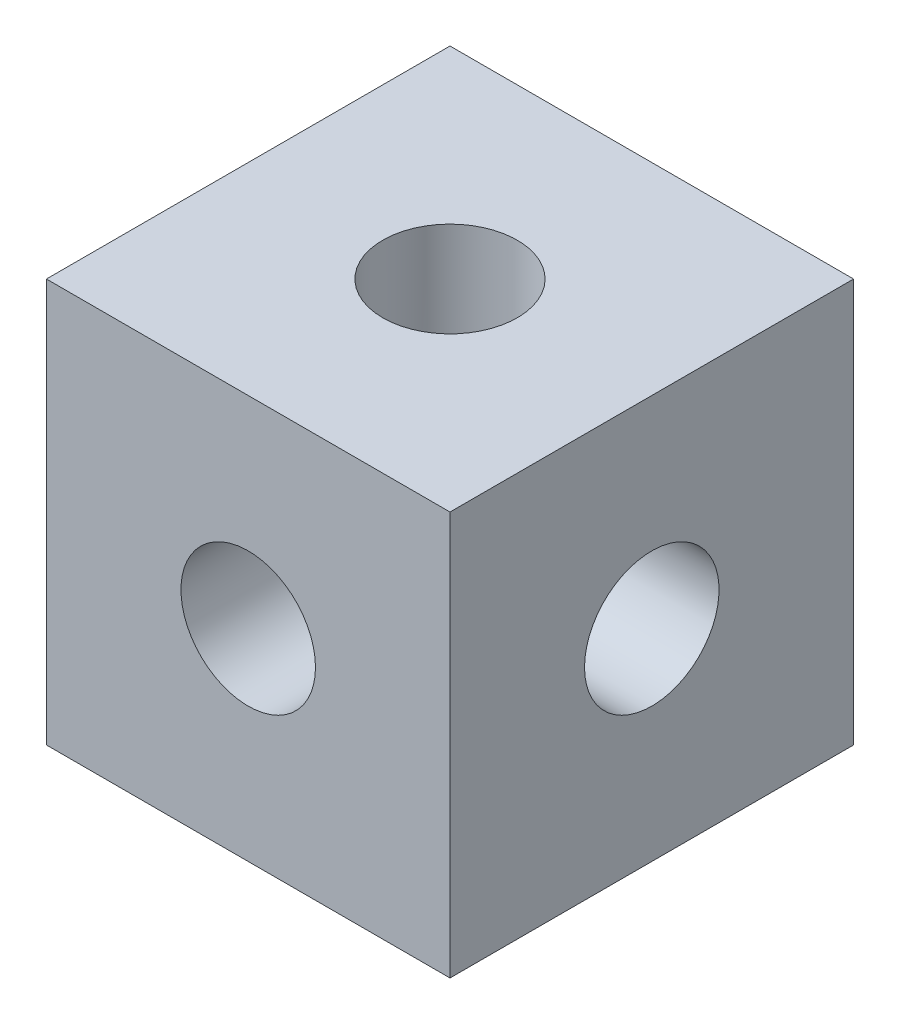
ISO-10303-21;
HEADER;
FILE_DESCRIPTION(('STEP AP214'),'2;1');
FILE_NAME('part.step','',(''),(''),'','','');
FILE_SCHEMA(('AUTOMOTIVE_DESIGN { 1 0 10303 214 1 1 1 1 }'));
ENDSEC;
DATA;
#1=APPLICATION_CONTEXT('core data for automotive mechanical design processes');
#2=APPLICATION_PROTOCOL_DEFINITION('international standard','automotive_design',2000,#1);
#3=PRODUCT_CONTEXT('',#1,'mechanical');
#4=PRODUCT('Part','Part','',(#3));
#5=PRODUCT_RELATED_PRODUCT_CATEGORY('part','',(#4));
#6=PRODUCT_DEFINITION_FORMATION('','',#4);
#7=PRODUCT_DEFINITION_CONTEXT('part definition',#1,'design');
#8=PRODUCT_DEFINITION('design','',#6,#7);
#9=PRODUCT_DEFINITION_SHAPE('','',#8);
#10=(LENGTH_UNIT() NAMED_UNIT(*) SI_UNIT(.MILLI.,.METRE.));
#11=(NAMED_UNIT(*) PLANE_ANGLE_UNIT() SI_UNIT($,.RADIAN.));
#12=(NAMED_UNIT(*) SI_UNIT($,.STERADIAN.) SOLID_ANGLE_UNIT());
#13=UNCERTAINTY_MEASURE_WITH_UNIT(LENGTH_MEASURE(1.E-05),#10,'distance_accuracy_value','');
#14=(GEOMETRIC_REPRESENTATION_CONTEXT(3) GLOBAL_UNCERTAINTY_ASSIGNED_CONTEXT((#13)) GLOBAL_UNIT_ASSIGNED_CONTEXT((#10,
#11,#12)) REPRESENTATION_CONTEXT('',''));
#15=CARTESIAN_POINT('',(0.,0.,0.));
#16=DIRECTION('',(0.,0.,1.));
#17=DIRECTION('',(1.,0.,0.));
#18=AXIS2_PLACEMENT_3D('',#15,#16,#17);
#19=CARTESIAN_POINT('',(0.,0.,0.));
#20=DIRECTION('',(0.,1.,0.));
#21=DIRECTION('',(0.,0.,1.));
#22=AXIS2_PLACEMENT_3D('',#19,#20,#21);
#23=CYLINDRICAL_SURFACE('',#22,2.5);
#24=CARTESIAN_POINT('',(0.,15.,0.));
#25=DIRECTION('',(0.,1.,0.));
#26=DIRECTION('',(0.,0.,1.));
#27=AXIS2_PLACEMENT_3D('',#24,#25,#26);
#28=CIRCLE('',#27,2.5);
#29=CARTESIAN_POINT('',(0.,15.,2.5));
#30=VERTEX_POINT('',#29);
#31=EDGE_CURVE('E175',#30,#30,#28,.T.);
#32=ORIENTED_EDGE('',*,*,#31,.T.);
#33=EDGE_LOOP('',(#32));
#34=FACE_BOUND('',#33,.T.);
#35=CARTESIAN_POINT('',(0.,7.50000000000001,0.));
#36=DIRECTION('',(0.707106781186547,0.707106781186547,0.));
#37=DIRECTION('',(-0.707106781186547,0.707106781186547,0.));
#38=AXIS2_PLACEMENT_3D('',#35,#36,#37);
#39=ELLIPSE('',#38,3.53553390593274,2.5);
#40=CARTESIAN_POINT('',(-1.76776695296638,9.26776695296639,1.76776695296637));
#41=VERTEX_POINT('',#40);
#42=CARTESIAN_POINT('',(-1.76776695296638,9.26776695296638,-1.76776695296636));
#43=VERTEX_POINT('',#42);
#44=EDGE_CURVE('E115',#41,#43,#39,.F.);
#45=ORIENTED_EDGE('',*,*,#44,.T.);
#46=CARTESIAN_POINT('',(0.,7.50000000000002,0.));
#47=DIRECTION('',(0.,0.707106781186547,0.707106781186547));
#48=DIRECTION('',(0.,0.707106781186547,-0.707106781186547));
#49=AXIS2_PLACEMENT_3D('',#46,#47,#48);
#50=ELLIPSE('',#49,3.53553390593274,2.5);
#51=CARTESIAN_POINT('',(1.76776695296636,9.26776695296637,-1.76776695296637));
#52=VERTEX_POINT('',#51);
#53=EDGE_CURVE('E103',#43,#52,#50,.F.);
#54=ORIENTED_EDGE('',*,*,#53,.T.);
#55=CARTESIAN_POINT('',(0.,7.50000000000001,0.));
#56=DIRECTION('',(-0.707106781186547,0.707106781186547,0.));
#57=DIRECTION('',(0.707106781186547,0.707106781186547,0.));
#58=AXIS2_PLACEMENT_3D('',#55,#56,#57);
#59=ELLIPSE('',#58,3.53553390593274,2.5);
#60=CARTESIAN_POINT('',(1.76776695296636,9.26776695296637,1.76776695296639));
#61=VERTEX_POINT('',#60);
#62=EDGE_CURVE('E110',#52,#61,#59,.F.);
#63=ORIENTED_EDGE('',*,*,#62,.T.);
#64=CARTESIAN_POINT('',(0.,7.50000000000002,0.));
#65=DIRECTION('',(0.,0.707106781186547,-0.707106781186547));
#66=DIRECTION('',(0.,0.707106781186547,0.707106781186547));
#67=AXIS2_PLACEMENT_3D('',#64,#65,#66);
#68=ELLIPSE('',#67,3.53553390593274,2.5);
#69=EDGE_CURVE('E55',#61,#41,#68,.F.);
#70=ORIENTED_EDGE('',*,*,#69,.T.);
#71=EDGE_LOOP('',(#45,#54,#63,#70));
#72=FACE_BOUND('',#71,.T.);
#73=ADVANCED_FACE('F39',(#34,#72),#23,.F.);
#74=CARTESIAN_POINT('',(7.49999999999998,15.,7.50000000000002));
#75=DIRECTION('',(-1.,0.,0.));
#76=DIRECTION('',(0.,0.,1.));
#77=AXIS2_PLACEMENT_3D('',#74,#75,#76);
#78=PLANE('',#77);
#79=CARTESIAN_POINT('',(7.49999999999998,7.50000000000001,0.));
#80=DIRECTION('',(-1.,0.,0.));
#81=DIRECTION('',(0.,0.,1.));
#82=AXIS2_PLACEMENT_3D('',#79,#80,#81);
#83=CIRCLE('',#82,2.5);
#84=CARTESIAN_POINT('',(7.49999999999998,7.50000000000001,2.50000000000002));
#85=VERTEX_POINT('',#84);
#86=EDGE_CURVE('E179',#85,#85,#83,.T.);
#87=ORIENTED_EDGE('',*,*,#86,.T.);
#88=EDGE_LOOP('',(#87));
#89=FACE_BOUND('',#88,.T.);
#90=DIRECTION('',(0.,0.,-1.));
#91=VECTOR('',#90,1.);
#92=CARTESIAN_POINT('',(7.49999999999998,0.,7.50000000000002));
#93=LINE('',#92,#91);
#94=CARTESIAN_POINT('',(7.49999999999998,0.,7.50000000000002));
#95=VERTEX_POINT('',#94);
#96=CARTESIAN_POINT('',(7.49999999999998,0.,-7.49999999999999));
#97=VERTEX_POINT('',#96);
#98=EDGE_CURVE('E159',#95,#97,#93,.T.);
#99=ORIENTED_EDGE('',*,*,#98,.T.);
#100=DIRECTION('',(0.,-1.,0.));
#101=VECTOR('',#100,1.);
#102=CARTESIAN_POINT('',(7.49999999999998,15.,-7.49999999999999));
#103=LINE('',#102,#101);
#104=CARTESIAN_POINT('',(7.49999999999998,15.,-7.49999999999999));
#105=VERTEX_POINT('',#104);
#106=EDGE_CURVE('E132',#105,#97,#103,.T.);
#107=ORIENTED_EDGE('',*,*,#106,.F.);
#108=DIRECTION('',(0.,0.,-1.));
#109=VECTOR('',#108,1.);
#110=CARTESIAN_POINT('',(7.49999999999998,15.,7.50000000000002));
#111=LINE('',#110,#109);
#112=CARTESIAN_POINT('',(7.49999999999998,15.,7.50000000000002));
#113=VERTEX_POINT('',#112);
#114=EDGE_CURVE('E152',#113,#105,#111,.T.);
#115=ORIENTED_EDGE('',*,*,#114,.F.);
#116=DIRECTION('',(0.,-1.,0.));
#117=VECTOR('',#116,1.);
#118=CARTESIAN_POINT('',(7.49999999999998,15.,7.50000000000002));
#119=LINE('',#118,#117);
#120=EDGE_CURVE('E144',#113,#95,#119,.T.);
#121=ORIENTED_EDGE('',*,*,#120,.T.);
#122=EDGE_LOOP('',(#99,#107,#115,#121));
#123=FACE_BOUND('',#122,.T.);
#124=ADVANCED_FACE('F41',(#89,#123),#78,.F.);
#125=CARTESIAN_POINT('',(-7.50000000000003,15.,-7.49999999999999));
#126=DIRECTION('',(0.,0.,1.));
#127=DIRECTION('',(1.,0.,0.));
#128=AXIS2_PLACEMENT_3D('',#125,#126,#127);
#129=PLANE('',#128);
#130=CARTESIAN_POINT('',(0.,7.50000000000002,-7.49999999999999));
#131=DIRECTION('',(0.,0.,1.));
#132=DIRECTION('',(1.,0.,0.));
#133=AXIS2_PLACEMENT_3D('',#130,#131,#132);
#134=CIRCLE('',#133,2.5);
#135=CARTESIAN_POINT('',(2.49999999999998,7.50000000000002,-7.49999999999999));
#136=VERTEX_POINT('',#135);
#137=EDGE_CURVE('E204',#136,#136,#134,.T.);
#138=ORIENTED_EDGE('',*,*,#137,.T.);
#139=EDGE_LOOP('',(#138));
#140=FACE_BOUND('',#139,.T.);
#141=DIRECTION('',(-1.,0.,0.));
#142=VECTOR('',#141,1.);
#143=CARTESIAN_POINT('',(-7.50000000000003,0.,-7.49999999999999));
#144=LINE('',#143,#142);
#145=CARTESIAN_POINT('',(-7.50000000000003,0.,-7.49999999999999));
#146=VERTEX_POINT('',#145);
#147=EDGE_CURVE('E156',#97,#146,#144,.T.);
#148=ORIENTED_EDGE('',*,*,#147,.T.);
#149=DIRECTION('',(0.,-1.,0.));
#150=VECTOR('',#149,1.);
#151=CARTESIAN_POINT('',(-7.50000000000003,15.,-7.49999999999999));
#152=LINE('',#151,#150);
#153=CARTESIAN_POINT('',(-7.50000000000003,15.,-7.49999999999999));
#154=VERTEX_POINT('',#153);
#155=EDGE_CURVE('E136',#154,#146,#152,.T.);
#156=ORIENTED_EDGE('',*,*,#155,.F.);
#157=DIRECTION('',(-1.,0.,0.));
#158=VECTOR('',#157,1.);
#159=CARTESIAN_POINT('',(-7.50000000000003,15.,-7.49999999999999));
#160=LINE('',#159,#158);
#161=EDGE_CURVE('E169',#105,#154,#160,.T.);
#162=ORIENTED_EDGE('',*,*,#161,.F.);
#163=ORIENTED_EDGE('',*,*,#106,.T.);
#164=EDGE_LOOP('',(#148,#156,#162,#163));
#165=FACE_BOUND('',#164,.T.);
#166=ADVANCED_FACE('F213',(#140,#165),#129,.F.);
#167=CARTESIAN_POINT('',(-7.50000000000003,15.,7.50000000000002));
#168=DIRECTION('',(1.,0.,0.));
#169=DIRECTION('',(0.,0.,-1.));
#170=AXIS2_PLACEMENT_3D('',#167,#168,#169);
#171=PLANE('',#170);
#172=CARTESIAN_POINT('',(-7.50000000000003,7.50000000000001,0.));
#173=DIRECTION('',(-1.,0.,0.));
#174=DIRECTION('',(0.,0.,1.));
#175=AXIS2_PLACEMENT_3D('',#172,#173,#174);
#176=CIRCLE('',#175,2.5);
#177=CARTESIAN_POINT('',(-7.50000000000003,7.50000000000001,2.50000000000002));
#178=VERTEX_POINT('',#177);
#179=EDGE_CURVE('E183',#178,#178,#176,.T.);
#180=ORIENTED_EDGE('',*,*,#179,.F.);
#181=EDGE_LOOP('',(#180));
#182=FACE_BOUND('',#181,.T.);
#183=DIRECTION('',(0.,0.,1.));
#184=VECTOR('',#183,1.);
#185=CARTESIAN_POINT('',(-7.50000000000003,0.,7.50000000000002));
#186=LINE('',#185,#184);
#187=CARTESIAN_POINT('',(-7.50000000000003,0.,7.50000000000002));
#188=VERTEX_POINT('',#187);
#189=EDGE_CURVE('E153',#146,#188,#186,.T.);
#190=ORIENTED_EDGE('',*,*,#189,.T.);
#191=DIRECTION('',(0.,-1.,0.));
#192=VECTOR('',#191,1.);
#193=CARTESIAN_POINT('',(-7.50000000000003,15.,7.50000000000002));
#194=LINE('',#193,#192);
#195=CARTESIAN_POINT('',(-7.50000000000003,15.,7.50000000000002));
#196=VERTEX_POINT('',#195);
#197=EDGE_CURVE('E140',#196,#188,#194,.T.);
#198=ORIENTED_EDGE('',*,*,#197,.F.);
#199=DIRECTION('',(0.,0.,1.));
#200=VECTOR('',#199,1.);
#201=CARTESIAN_POINT('',(-7.50000000000003,15.,7.50000000000002));
#202=LINE('',#201,#200);
#203=EDGE_CURVE('E166',#154,#196,#202,.T.);
#204=ORIENTED_EDGE('',*,*,#203,.F.);
#205=ORIENTED_EDGE('',*,*,#155,.T.);
#206=EDGE_LOOP('',(#190,#198,#204,#205));
#207=FACE_BOUND('',#206,.T.);
#208=ADVANCED_FACE('F264',(#182,#207),#171,.F.);
#209=CARTESIAN_POINT('',(-7.50000000000003,15.,7.50000000000002));
#210=DIRECTION('',(0.,0.,-1.));
#211=DIRECTION('',(-1.,0.,0.));
#212=AXIS2_PLACEMENT_3D('',#209,#210,#211);
#213=PLANE('',#212);
#214=CARTESIAN_POINT('',(0.,7.50000000000002,7.50000000000002));
#215=DIRECTION('',(0.,0.,1.));
#216=DIRECTION('',(1.,0.,0.));
#217=AXIS2_PLACEMENT_3D('',#214,#215,#216);
#218=CIRCLE('',#217,2.5);
#219=CARTESIAN_POINT('',(2.49999999999998,7.50000000000002,7.50000000000002));
#220=VERTEX_POINT('',#219);
#221=EDGE_CURVE('E205',#220,#220,#218,.T.);
#222=ORIENTED_EDGE('',*,*,#221,.F.);
#223=EDGE_LOOP('',(#222));
#224=FACE_BOUND('',#223,.T.);
#225=DIRECTION('',(1.,0.,0.));
#226=VECTOR('',#225,1.);
#227=CARTESIAN_POINT('',(-7.50000000000003,0.,7.50000000000002));
#228=LINE('',#227,#226);
#229=EDGE_CURVE('E149',#188,#95,#228,.T.);
#230=ORIENTED_EDGE('',*,*,#229,.T.);
#231=ORIENTED_EDGE('',*,*,#120,.F.);
#232=DIRECTION('',(1.,0.,0.));
#233=VECTOR('',#232,1.);
#234=CARTESIAN_POINT('',(-7.50000000000003,15.,7.50000000000002));
#235=LINE('',#234,#233);
#236=EDGE_CURVE('E148',#196,#113,#235,.T.);
#237=ORIENTED_EDGE('',*,*,#236,.F.);
#238=ORIENTED_EDGE('',*,*,#197,.T.);
#239=EDGE_LOOP('',(#230,#231,#237,#238));
#240=FACE_BOUND('',#239,.T.);
#241=ADVANCED_FACE('F260',(#224,#240),#213,.F.);
#242=CARTESIAN_POINT('',(0.,15.,0.));
#243=DIRECTION('',(0.,-1.,0.));
#244=DIRECTION('',(0.,0.,-1.));
#245=AXIS2_PLACEMENT_3D('',#242,#243,#244);
#246=PLANE('',#245);
#247=ORIENTED_EDGE('',*,*,#31,.F.);
#248=EDGE_LOOP('',(#247));
#249=FACE_BOUND('',#248,.T.);
#250=ORIENTED_EDGE('',*,*,#114,.T.);
#251=ORIENTED_EDGE('',*,*,#161,.T.);
#252=ORIENTED_EDGE('',*,*,#203,.T.);
#253=ORIENTED_EDGE('',*,*,#236,.T.);
#254=EDGE_LOOP('',(#250,#251,#252,#253));
#255=FACE_BOUND('',#254,.T.);
#256=ADVANCED_FACE('F244',(#249,#255),#246,.F.);
#257=CARTESIAN_POINT('',(0.,0.,0.));
#258=DIRECTION('',(0.,-1.,0.));
#259=DIRECTION('',(0.,0.,-1.));
#260=AXIS2_PLACEMENT_3D('',#257,#258,#259);
#261=PLANE('',#260);
#262=CARTESIAN_POINT('',(0.,0.,0.));
#263=DIRECTION('',(0.,1.,0.));
#264=DIRECTION('',(0.,0.,1.));
#265=AXIS2_PLACEMENT_3D('',#262,#263,#264);
#266=CIRCLE('',#265,2.5);
#267=CARTESIAN_POINT('',(0.,0.,2.5));
#268=VERTEX_POINT('',#267);
#269=EDGE_CURVE('E163',#268,#268,#266,.T.);
#270=ORIENTED_EDGE('',*,*,#269,.T.);
#271=EDGE_LOOP('',(#270));
#272=FACE_BOUND('',#271,.T.);
#273=ORIENTED_EDGE('',*,*,#98,.F.);
#274=ORIENTED_EDGE('',*,*,#229,.F.);
#275=ORIENTED_EDGE('',*,*,#189,.F.);
#276=ORIENTED_EDGE('',*,*,#147,.F.);
#277=EDGE_LOOP('',(#273,#274,#275,#276));
#278=FACE_BOUND('',#277,.T.);
#279=ADVANCED_FACE('F237',(#272,#278),#261,.T.);
#280=CARTESIAN_POINT('',(0.,7.50000000000001,0.));
#281=DIRECTION('',(-0.707106781186547,0.707106781186547,0.));
#282=DIRECTION('',(0.707106781186547,0.707106781186547,0.));
#283=AXIS2_PLACEMENT_3D('',#280,#281,#282);
#284=ELLIPSE('',#283,3.53553390593274,2.5);
#285=CARTESIAN_POINT('',(-1.76776695296636,5.73223304703364,-1.76776695296638));
#286=VERTEX_POINT('',#285);
#287=CARTESIAN_POINT('',(-1.76776695296637,5.73223304703364,1.76776695296638));
#288=VERTEX_POINT('',#287);
#289=EDGE_CURVE('E121',#286,#288,#284,.T.);
#290=ORIENTED_EDGE('',*,*,#289,.T.);
#291=CARTESIAN_POINT('',(0.,7.50000000000002,0.));
#292=DIRECTION('',(0.,0.707106781186547,0.707106781186547));
#293=DIRECTION('',(0.,0.707106781186547,-0.707106781186547));
#294=AXIS2_PLACEMENT_3D('',#291,#292,#293);
#295=ELLIPSE('',#294,3.53553390593274,2.5);
#296=CARTESIAN_POINT('',(1.76776695296636,5.73223304703365,1.76776695296639));
#297=VERTEX_POINT('',#296);
#298=EDGE_CURVE('E196',#288,#297,#295,.T.);
#299=ORIENTED_EDGE('',*,*,#298,.T.);
#300=CARTESIAN_POINT('',(0.,7.50000000000001,0.));
#301=DIRECTION('',(0.707106781186547,0.707106781186547,0.));
#302=DIRECTION('',(-0.707106781186547,0.707106781186547,0.));
#303=AXIS2_PLACEMENT_3D('',#300,#301,#302);
#304=ELLIPSE('',#303,3.53553390593274,2.5);
#305=CARTESIAN_POINT('',(1.76776695296636,5.73223304703365,-1.76776695296637));
#306=VERTEX_POINT('',#305);
#307=EDGE_CURVE('E125',#297,#306,#304,.T.);
#308=ORIENTED_EDGE('',*,*,#307,.T.);
#309=CARTESIAN_POINT('',(0.,7.50000000000002,0.));
#310=DIRECTION('',(0.,0.707106781186547,-0.707106781186547));
#311=DIRECTION('',(0.,0.707106781186547,0.707106781186547));
#312=AXIS2_PLACEMENT_3D('',#309,#310,#311);
#313=ELLIPSE('',#312,3.53553390593274,2.5);
#314=EDGE_CURVE('E62',#306,#286,#313,.T.);
#315=ORIENTED_EDGE('',*,*,#314,.T.);
#316=EDGE_LOOP('',(#290,#299,#308,#315));
#317=FACE_BOUND('',#316,.T.);
#318=ORIENTED_EDGE('',*,*,#269,.F.);
#319=EDGE_LOOP('',(#318));
#320=FACE_BOUND('',#319,.T.);
#321=ADVANCED_FACE('F230',(#317,#320),#23,.F.);
#322=CARTESIAN_POINT('',(7.49999999999998,7.50000000000001,0.));
#323=DIRECTION('',(-1.,0.,0.));
#324=DIRECTION('',(0.,0.,1.));
#325=AXIS2_PLACEMENT_3D('',#322,#323,#324);
#326=CYLINDRICAL_SURFACE('',#325,2.5);
#327=ORIENTED_EDGE('',*,*,#179,.T.);
#328=EDGE_LOOP('',(#327));
#329=FACE_BOUND('',#328,.T.);
#330=ORIENTED_EDGE('',*,*,#289,.F.);
#331=CARTESIAN_POINT('',(0.,7.50000000000001,0.));
#332=DIRECTION('',(-0.707106781186547,0.,0.707106781186547));
#333=DIRECTION('',(-0.707106781186547,0.,-0.707106781186547));
#334=AXIS2_PLACEMENT_3D('',#331,#332,#333);
#335=ELLIPSE('',#334,3.53553390593274,2.5);
#336=EDGE_CURVE('E117',#286,#43,#335,.F.);
#337=ORIENTED_EDGE('',*,*,#336,.T.);
#338=ORIENTED_EDGE('',*,*,#44,.F.);
#339=CARTESIAN_POINT('',(0.,7.50000000000001,0.));
#340=DIRECTION('',(-0.707106781186547,0.,-0.707106781186547));
#341=DIRECTION('',(-0.707106781186547,0.,0.707106781186547));
#342=AXIS2_PLACEMENT_3D('',#339,#340,#341);
#343=ELLIPSE('',#342,3.53553390593274,2.5);
#344=EDGE_CURVE('E187',#41,#288,#343,.F.);
#345=ORIENTED_EDGE('',*,*,#344,.T.);
#346=EDGE_LOOP('',(#330,#337,#338,#345));
#347=FACE_BOUND('',#346,.T.);
#348=ADVANCED_FACE('F224',(#329,#347),#326,.F.);
#349=ORIENTED_EDGE('',*,*,#86,.F.);
#350=EDGE_LOOP('',(#349));
#351=FACE_BOUND('',#350,.T.);
#352=ORIENTED_EDGE('',*,*,#307,.F.);
#353=CARTESIAN_POINT('',(0.,7.50000000000001,0.));
#354=DIRECTION('',(-0.707106781186547,0.,0.707106781186547));
#355=DIRECTION('',(-0.707106781186547,0.,-0.707106781186547));
#356=AXIS2_PLACEMENT_3D('',#353,#354,#355);
#357=ELLIPSE('',#356,3.53553390593274,2.5);
#358=EDGE_CURVE('E11',#297,#61,#357,.T.);
#359=ORIENTED_EDGE('',*,*,#358,.T.);
#360=ORIENTED_EDGE('',*,*,#62,.F.);
#361=CARTESIAN_POINT('',(0.,7.50000000000001,0.));
#362=DIRECTION('',(-0.707106781186547,0.,-0.707106781186547));
#363=DIRECTION('',(-0.707106781186547,0.,0.707106781186547));
#364=AXIS2_PLACEMENT_3D('',#361,#362,#363);
#365=ELLIPSE('',#364,3.53553390593274,2.5);
#366=EDGE_CURVE('E48',#52,#306,#365,.T.);
#367=ORIENTED_EDGE('',*,*,#366,.T.);
#368=EDGE_LOOP('',(#352,#359,#360,#367));
#369=FACE_BOUND('',#368,.T.);
#370=ADVANCED_FACE('F119',(#351,#369),#326,.F.);
#371=CARTESIAN_POINT('',(0.,7.50000000000002,-7.49999999999999));
#372=DIRECTION('',(0.,0.,1.));
#373=DIRECTION('',(1.,0.,0.));
#374=AXIS2_PLACEMENT_3D('',#371,#372,#373);
#375=CYLINDRICAL_SURFACE('',#374,2.5);
#376=ORIENTED_EDGE('',*,*,#137,.F.);
#377=EDGE_LOOP('',(#376));
#378=FACE_BOUND('',#377,.T.);
#379=ORIENTED_EDGE('',*,*,#314,.F.);
#380=ORIENTED_EDGE('',*,*,#366,.F.);
#381=ORIENTED_EDGE('',*,*,#53,.F.);
#382=ORIENTED_EDGE('',*,*,#336,.F.);
#383=EDGE_LOOP('',(#379,#380,#381,#382));
#384=FACE_BOUND('',#383,.T.);
#385=ADVANCED_FACE('F102',(#378,#384),#375,.F.);
#386=ORIENTED_EDGE('',*,*,#221,.T.);
#387=EDGE_LOOP('',(#386));
#388=FACE_BOUND('',#387,.T.);
#389=ORIENTED_EDGE('',*,*,#69,.F.);
#390=ORIENTED_EDGE('',*,*,#358,.F.);
#391=ORIENTED_EDGE('',*,*,#298,.F.);
#392=ORIENTED_EDGE('',*,*,#344,.F.);
#393=EDGE_LOOP('',(#389,#390,#391,#392));
#394=FACE_BOUND('',#393,.T.);
#395=ADVANCED_FACE('F217',(#388,#394),#375,.F.);
#396=CLOSED_SHELL('',(#73,#124,#166,#208,#241,#256,#279,#321,#348,#370,#385,#395));
#397=MANIFOLD_SOLID_BREP('B2',#396);
#398=ADVANCED_BREP_SHAPE_REPRESENTATION('',(#18,#397),#14);
#399=SHAPE_DEFINITION_REPRESENTATION(#9,#398);
ENDSEC;
END-ISO-10303-21;
